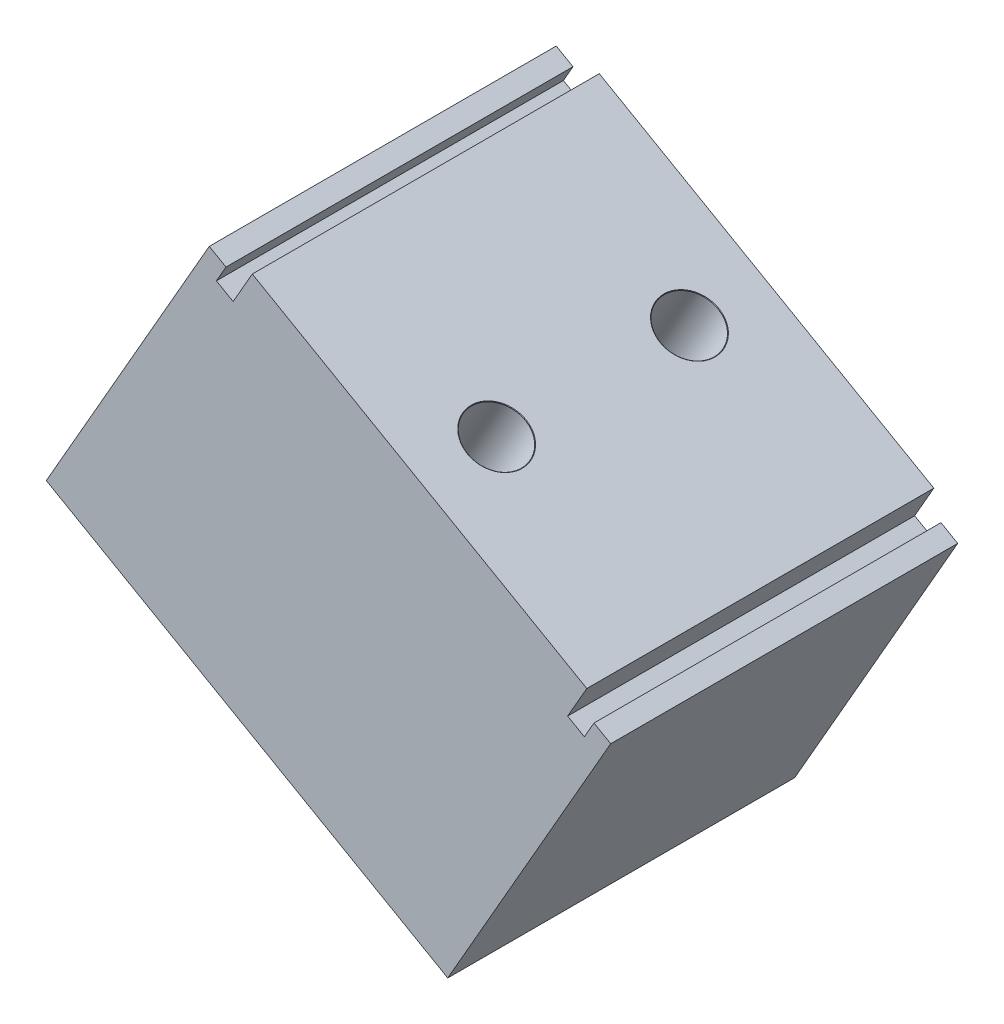
ISO-10303-21;
HEADER;
FILE_DESCRIPTION(('STEP AP214'),'2;1');
FILE_NAME('part.step','',(''),(''),'','','');
FILE_SCHEMA(('AUTOMOTIVE_DESIGN { 1 0 10303 214 1 1 1 1 }'));
ENDSEC;
DATA;
#1=APPLICATION_CONTEXT('core data for automotive mechanical design processes');
#2=APPLICATION_PROTOCOL_DEFINITION('international standard','automotive_design',2000,#1);
#3=PRODUCT_CONTEXT('',#1,'mechanical');
#4=PRODUCT('Part','Part','',(#3));
#5=PRODUCT_RELATED_PRODUCT_CATEGORY('part','',(#4));
#6=PRODUCT_DEFINITION_FORMATION('','',#4);
#7=PRODUCT_DEFINITION_CONTEXT('part definition',#1,'design');
#8=PRODUCT_DEFINITION('design','',#6,#7);
#9=PRODUCT_DEFINITION_SHAPE('','',#8);
#10=(LENGTH_UNIT() NAMED_UNIT(*) SI_UNIT(.MILLI.,.METRE.));
#11=(NAMED_UNIT(*) PLANE_ANGLE_UNIT() SI_UNIT($,.RADIAN.));
#12=(NAMED_UNIT(*) SI_UNIT($,.STERADIAN.) SOLID_ANGLE_UNIT());
#13=UNCERTAINTY_MEASURE_WITH_UNIT(LENGTH_MEASURE(1.E-05),#10,'distance_accuracy_value','');
#14=(GEOMETRIC_REPRESENTATION_CONTEXT(3) GLOBAL_UNCERTAINTY_ASSIGNED_CONTEXT((#13)) GLOBAL_UNIT_ASSIGNED_CONTEXT((#10,
#11,#12)) REPRESENTATION_CONTEXT('',''));
#15=CARTESIAN_POINT('',(0.,0.,0.));
#16=DIRECTION('',(0.,0.,1.));
#17=DIRECTION('',(1.,0.,0.));
#18=AXIS2_PLACEMENT_3D('',#15,#16,#17);
#19=CARTESIAN_POINT('',(50.8679611410851,-59.8679485135977,9.));
#20=DIRECTION('',(0.497216671518887,0.867626406677251,0.));
#21=DIRECTION('',(-0.867626406677252,0.497216671518887,0.));
#22=AXIS2_PLACEMENT_3D('',#19,#20,#21);
#23=PLANE('',#22);
#24=CARTESIAN_POINT('',(59.5442252078576,-64.8401152287865,5.));
#25=DIRECTION('',(-0.497216671518887,-0.867626406677251,0.));
#26=DIRECTION('',(-0.867626406677251,0.497216671518887,0.));
#27=AXIS2_PLACEMENT_3D('',#24,#25,#26);
#28=CIRCLE('',#27,1.525);
#29=CARTESIAN_POINT('',(58.2210949376748,-64.0818598047202,5.));
#30=VERTEX_POINT('',#29);
#31=EDGE_CURVE('E148',#30,#30,#28,.T.);
#32=ORIENTED_EDGE('',*,*,#31,.T.);
#33=EDGE_LOOP('',(#32));
#34=FACE_BOUND('',#33,.T.);
#35=CARTESIAN_POINT('',(59.5442252078576,-64.8401152287865,-5.));
#36=DIRECTION('',(-0.497216671518887,-0.867626406677251,0.));
#37=DIRECTION('',(-0.867626406677251,0.497216671518887,0.));
#38=AXIS2_PLACEMENT_3D('',#35,#36,#37);
#39=CIRCLE('',#38,1.525);
#40=CARTESIAN_POINT('',(58.2210949376748,-64.0818598047202,-5.));
#41=VERTEX_POINT('',#40);
#42=EDGE_CURVE('E141',#41,#41,#39,.T.);
#43=ORIENTED_EDGE('',*,*,#42,.T.);
#44=EDGE_LOOP('',(#43));
#45=FACE_BOUND('',#44,.T.);
#46=DIRECTION('',(0.,0.,-1.));
#47=VECTOR('',#46,1.);
#48=CARTESIAN_POINT('',(50.8679611410851,-59.8679485135977,9.));
#49=LINE('',#48,#47);
#50=CARTESIAN_POINT('',(50.8679611410851,-59.8679485135977,9.));
#51=VERTEX_POINT('',#50);
#52=CARTESIAN_POINT('',(50.8679611410851,-59.8679485135977,-9.));
#53=VERTEX_POINT('',#52);
#54=EDGE_CURVE('E40',#51,#53,#49,.T.);
#55=ORIENTED_EDGE('',*,*,#54,.F.);
#56=DIRECTION('',(-0.867626406677251,0.497216671518887,0.));
#57=VECTOR('',#56,1.);
#58=CARTESIAN_POINT('',(50.8679611410851,-59.8679485135977,9.));
#59=LINE('',#58,#57);
#60=CARTESIAN_POINT('',(68.2204892746301,-69.8122819439754,9.));
#61=VERTEX_POINT('',#60);
#62=EDGE_CURVE('E182',#61,#51,#59,.T.);
#63=ORIENTED_EDGE('',*,*,#62,.F.);
#64=DIRECTION('',(0.,0.,-1.));
#65=VECTOR('',#64,1.);
#66=CARTESIAN_POINT('',(68.2204892746301,-69.8122819439754,9.));
#67=LINE('',#66,#65);
#68=CARTESIAN_POINT('',(68.2204892746301,-69.8122819439754,-9.));
#69=VERTEX_POINT('',#68);
#70=EDGE_CURVE('E11',#61,#69,#67,.T.);
#71=ORIENTED_EDGE('',*,*,#70,.T.);
#72=DIRECTION('',(-0.867626406677251,0.497216671518887,0.));
#73=VECTOR('',#72,1.);
#74=CARTESIAN_POINT('',(50.8679611410851,-59.8679485135977,-9.));
#75=LINE('',#74,#73);
#76=EDGE_CURVE('E157',#69,#53,#75,.T.);
#77=ORIENTED_EDGE('',*,*,#76,.T.);
#78=EDGE_LOOP('',(#55,#63,#71,#77));
#79=FACE_BOUND('',#78,.T.);
#80=ADVANCED_FACE('F37',(#34,#45,#79),#23,.T.);
#81=CARTESIAN_POINT('',(68.2204892746301,-69.8122819439754,9.));
#82=DIRECTION('',(0.867626406677254,-0.497216671518883,0.));
#83=DIRECTION('',(0.497216671518883,0.867626406677254,0.));
#84=AXIS2_PLACEMENT_3D('',#81,#82,#83);
#85=PLANE('',#84);
#86=ORIENTED_EDGE('',*,*,#70,.F.);
#87=DIRECTION('',(0.497216671518883,0.867626406677254,0.));
#88=VECTOR('',#87,1.);
#89=CARTESIAN_POINT('',(68.2204892746301,-69.8122819439754,9.));
#90=LINE('',#89,#88);
#91=CARTESIAN_POINT('',(67.2260559315923,-71.5475347573299,9.));
#92=VERTEX_POINT('',#91);
#93=EDGE_CURVE('E53',#92,#61,#90,.T.);
#94=ORIENTED_EDGE('',*,*,#93,.F.);
#95=DIRECTION('',(0.,0.,-1.));
#96=VECTOR('',#95,1.);
#97=CARTESIAN_POINT('',(67.2260559315923,-71.5475347573299,9.));
#98=LINE('',#97,#96);
#99=CARTESIAN_POINT('',(67.2260559315923,-71.5475347573299,-9.));
#100=VERTEX_POINT('',#99);
#101=EDGE_CURVE('E45',#92,#100,#98,.T.);
#102=ORIENTED_EDGE('',*,*,#101,.T.);
#103=DIRECTION('',(0.497216671518883,0.867626406677254,0.));
#104=VECTOR('',#103,1.);
#105=CARTESIAN_POINT('',(68.2204892746301,-69.8122819439754,-9.));
#106=LINE('',#105,#104);
#107=EDGE_CURVE('E180',#100,#69,#106,.T.);
#108=ORIENTED_EDGE('',*,*,#107,.T.);
#109=EDGE_LOOP('',(#86,#94,#102,#108));
#110=FACE_BOUND('',#109,.T.);
#111=ADVANCED_FACE('F287',(#110),#85,.T.);
#112=CARTESIAN_POINT('',(67.2260559315923,-71.5475347573299,9.));
#113=DIRECTION('',(0.497216671518904,0.867626406677242,0.));
#114=DIRECTION('',(-0.867626406677242,0.497216671518904,0.));
#115=AXIS2_PLACEMENT_3D('',#112,#113,#114);
#116=PLANE('',#115);
#117=ORIENTED_EDGE('',*,*,#101,.F.);
#118=DIRECTION('',(-0.867626406677242,0.497216671518904,0.));
#119=VECTOR('',#118,1.);
#120=CARTESIAN_POINT('',(67.2260559315923,-71.5475347573299,9.));
#121=LINE('',#120,#119);
#122=CARTESIAN_POINT('',(68.0936823382696,-72.0447514288488,9.));
#123=VERTEX_POINT('',#122);
#124=EDGE_CURVE('E58',#123,#92,#121,.T.);
#125=ORIENTED_EDGE('',*,*,#124,.F.);
#126=DIRECTION('',(0.,0.,-1.));
#127=VECTOR('',#126,1.);
#128=CARTESIAN_POINT('',(68.0936823382696,-72.0447514288488,9.));
#129=LINE('',#128,#127);
#130=CARTESIAN_POINT('',(68.0936823382696,-72.0447514288488,-9.));
#131=VERTEX_POINT('',#130);
#132=EDGE_CURVE('E206',#123,#131,#129,.T.);
#133=ORIENTED_EDGE('',*,*,#132,.T.);
#134=DIRECTION('',(-0.867626406677242,0.497216671518904,0.));
#135=VECTOR('',#134,1.);
#136=CARTESIAN_POINT('',(67.2260559315923,-71.5475347573299,-9.));
#137=LINE('',#136,#135);
#138=EDGE_CURVE('E178',#131,#100,#137,.T.);
#139=ORIENTED_EDGE('',*,*,#138,.T.);
#140=EDGE_LOOP('',(#117,#125,#133,#139));
#141=FACE_BOUND('',#140,.T.);
#142=ADVANCED_FACE('F285',(#141),#116,.T.);
#143=CARTESIAN_POINT('',(68.0936823382696,-72.0447514288488,9.));
#144=DIRECTION('',(-0.867626406677257,0.497216671518877,0.));
#145=DIRECTION('',(-0.497216671518877,-0.867626406677257,0.));
#146=AXIS2_PLACEMENT_3D('',#143,#144,#145);
#147=PLANE('',#146);
#148=ORIENTED_EDGE('',*,*,#132,.F.);
#149=DIRECTION('',(-0.497216671518877,-0.867626406677257,0.));
#150=VECTOR('',#149,1.);
#151=CARTESIAN_POINT('',(68.0936823382696,-72.0447514288488,9.));
#152=LINE('',#151,#150);
#153=CARTESIAN_POINT('',(68.5908990097884,-71.1771250221715,9.));
#154=VERTEX_POINT('',#153);
#155=EDGE_CURVE('E200',#154,#123,#152,.T.);
#156=ORIENTED_EDGE('',*,*,#155,.F.);
#157=DIRECTION('',(0.,0.,-1.));
#158=VECTOR('',#157,1.);
#159=CARTESIAN_POINT('',(68.5908990097884,-71.1771250221715,9.));
#160=LINE('',#159,#158);
#161=CARTESIAN_POINT('',(68.5908990097884,-71.1771250221715,-9.));
#162=VERTEX_POINT('',#161);
#163=EDGE_CURVE('E209',#154,#162,#160,.T.);
#164=ORIENTED_EDGE('',*,*,#163,.T.);
#165=DIRECTION('',(-0.497216671518877,-0.867626406677257,0.));
#166=VECTOR('',#165,1.);
#167=CARTESIAN_POINT('',(68.0936823382696,-72.0447514288488,-9.));
#168=LINE('',#167,#166);
#169=EDGE_CURVE('E176',#162,#131,#168,.T.);
#170=ORIENTED_EDGE('',*,*,#169,.T.);
#171=EDGE_LOOP('',(#148,#156,#164,#170));
#172=FACE_BOUND('',#171,.T.);
#173=ADVANCED_FACE('F283',(#172),#147,.T.);
#174=CARTESIAN_POINT('',(68.5908990097884,-71.1771250221715,9.));
#175=DIRECTION('',(0.497216671518887,0.867626406677251,0.));
#176=DIRECTION('',(-0.867626406677251,0.497216671518887,0.));
#177=AXIS2_PLACEMENT_3D('',#174,#175,#176);
#178=PLANE('',#177);
#179=ORIENTED_EDGE('',*,*,#163,.F.);
#180=DIRECTION('',(-0.867626406677251,0.497216671518887,0.));
#181=VECTOR('',#180,1.);
#182=CARTESIAN_POINT('',(68.5908990097884,-71.1771250221715,9.));
#183=LINE('',#182,#181);
#184=CARTESIAN_POINT('',(69.4585254164657,-71.6743416936904,9.));
#185=VERTEX_POINT('',#184);
#186=EDGE_CURVE('E198',#185,#154,#183,.T.);
#187=ORIENTED_EDGE('',*,*,#186,.F.);
#188=DIRECTION('',(0.,0.,-1.));
#189=VECTOR('',#188,1.);
#190=CARTESIAN_POINT('',(69.4585254164657,-71.6743416936904,9.));
#191=LINE('',#190,#189);
#192=CARTESIAN_POINT('',(69.4585254164657,-71.6743416936904,-9.));
#193=VERTEX_POINT('',#192);
#194=EDGE_CURVE('E212',#185,#193,#191,.T.);
#195=ORIENTED_EDGE('',*,*,#194,.T.);
#196=DIRECTION('',(-0.867626406677251,0.497216671518887,0.));
#197=VECTOR('',#196,1.);
#198=CARTESIAN_POINT('',(68.5908990097884,-71.1771250221715,-9.));
#199=LINE('',#198,#197);
#200=EDGE_CURVE('E174',#193,#162,#199,.T.);
#201=ORIENTED_EDGE('',*,*,#200,.T.);
#202=EDGE_LOOP('',(#179,#187,#195,#201));
#203=FACE_BOUND('',#202,.T.);
#204=ADVANCED_FACE('F278',(#203),#178,.T.);
#205=CARTESIAN_POINT('',(69.4585254164657,-71.6743416936904,9.));
#206=DIRECTION('',(0.867626406677251,-0.497216671518888,0.));
#207=DIRECTION('',(0.497216671518888,0.867626406677251,0.));
#208=AXIS2_PLACEMENT_3D('',#205,#206,#207);
#209=PLANE('',#208);
#210=ORIENTED_EDGE('',*,*,#194,.F.);
#211=DIRECTION('',(0.497216671518888,0.867626406677251,0.));
#212=VECTOR('',#211,1.);
#213=CARTESIAN_POINT('',(69.4585254164657,-71.6743416936904,9.));
#214=LINE('',#213,#212);
#215=CARTESIAN_POINT('',(61.0058420006446,-86.4239906072037,9.));
#216=VERTEX_POINT('',#215);
#217=EDGE_CURVE('E196',#216,#185,#214,.T.);
#218=ORIENTED_EDGE('',*,*,#217,.F.);
#219=DIRECTION('',(0.,0.,-1.));
#220=VECTOR('',#219,1.);
#221=CARTESIAN_POINT('',(61.0058420006446,-86.4239906072037,9.));
#222=LINE('',#221,#220);
#223=CARTESIAN_POINT('',(61.0058420006446,-86.4239906072037,-9.));
#224=VERTEX_POINT('',#223);
#225=EDGE_CURVE('E215',#216,#224,#222,.T.);
#226=ORIENTED_EDGE('',*,*,#225,.T.);
#227=DIRECTION('',(0.497216671518888,0.867626406677251,0.));
#228=VECTOR('',#227,1.);
#229=CARTESIAN_POINT('',(69.4585254164657,-71.6743416936904,-9.));
#230=LINE('',#229,#228);
#231=EDGE_CURVE('E172',#224,#193,#230,.T.);
#232=ORIENTED_EDGE('',*,*,#231,.T.);
#233=EDGE_LOOP('',(#210,#218,#226,#232));
#234=FACE_BOUND('',#233,.T.);
#235=ADVANCED_FACE('F274',(#234),#209,.T.);
#236=CARTESIAN_POINT('',(40.1828082403906,-74.4907904907504,9.));
#237=DIRECTION('',(-0.497216671518887,-0.867626406677251,0.));
#238=DIRECTION('',(0.867626406677251,-0.497216671518887,0.));
#239=AXIS2_PLACEMENT_3D('',#236,#237,#238);
#240=PLANE('',#239);
#241=ORIENTED_EDGE('',*,*,#225,.F.);
#242=DIRECTION('',(0.867626406677251,-0.497216671518887,0.));
#243=VECTOR('',#242,1.);
#244=CARTESIAN_POINT('',(40.1828082403906,-74.4907904907504,9.));
#245=LINE('',#244,#243);
#246=CARTESIAN_POINT('',(40.1828082403906,-74.4907904907504,9.));
#247=VERTEX_POINT('',#246);
#248=EDGE_CURVE('E194',#247,#216,#245,.T.);
#249=ORIENTED_EDGE('',*,*,#248,.F.);
#250=DIRECTION('',(0.,0.,-1.));
#251=VECTOR('',#250,1.);
#252=CARTESIAN_POINT('',(40.1828082403906,-74.4907904907504,9.));
#253=LINE('',#252,#251);
#254=CARTESIAN_POINT('',(40.1828082403906,-74.4907904907504,-9.));
#255=VERTEX_POINT('',#254);
#256=EDGE_CURVE('E218',#247,#255,#253,.T.);
#257=ORIENTED_EDGE('',*,*,#256,.T.);
#258=DIRECTION('',(0.867626406677251,-0.497216671518887,0.));
#259=VECTOR('',#258,1.);
#260=CARTESIAN_POINT('',(40.1828082403906,-74.4907904907504,-9.));
#261=LINE('',#260,#259);
#262=EDGE_CURVE('E170',#255,#224,#261,.T.);
#263=ORIENTED_EDGE('',*,*,#262,.T.);
#264=EDGE_LOOP('',(#241,#249,#257,#263));
#265=FACE_BOUND('',#264,.T.);
#266=ADVANCED_FACE('F268',(#265),#240,.T.);
#267=CARTESIAN_POINT('',(48.6354916562117,-59.7411415772371,9.));
#268=DIRECTION('',(-0.867626406677252,0.497216671518886,0.));
#269=DIRECTION('',(-0.497216671518886,-0.867626406677252,0.));
#270=AXIS2_PLACEMENT_3D('',#267,#268,#269);
#271=PLANE('',#270);
#272=ORIENTED_EDGE('',*,*,#256,.F.);
#273=DIRECTION('',(-0.497216671518886,-0.867626406677252,0.));
#274=VECTOR('',#273,1.);
#275=CARTESIAN_POINT('',(48.6354916562117,-59.7411415772371,9.));
#276=LINE('',#275,#274);
#277=CARTESIAN_POINT('',(48.6354916562117,-59.7411415772371,9.));
#278=VERTEX_POINT('',#277);
#279=EDGE_CURVE('E192',#278,#247,#276,.T.);
#280=ORIENTED_EDGE('',*,*,#279,.F.);
#281=DIRECTION('',(0.,0.,-1.));
#282=VECTOR('',#281,1.);
#283=CARTESIAN_POINT('',(48.6354916562117,-59.7411415772371,9.));
#284=LINE('',#283,#282);
#285=CARTESIAN_POINT('',(48.6354916562117,-59.7411415772371,-9.));
#286=VERTEX_POINT('',#285);
#287=EDGE_CURVE('E221',#278,#286,#284,.T.);
#288=ORIENTED_EDGE('',*,*,#287,.T.);
#289=DIRECTION('',(-0.497216671518886,-0.867626406677252,0.));
#290=VECTOR('',#289,1.);
#291=CARTESIAN_POINT('',(48.6354916562117,-59.7411415772371,-9.));
#292=LINE('',#291,#290);
#293=EDGE_CURVE('E168',#286,#255,#292,.T.);
#294=ORIENTED_EDGE('',*,*,#293,.T.);
#295=EDGE_LOOP('',(#272,#280,#288,#294));
#296=FACE_BOUND('',#295,.T.);
#297=ADVANCED_FACE('F263',(#296),#271,.T.);
#298=CARTESIAN_POINT('',(49.5031180628889,-60.238358248756,9.));
#299=DIRECTION('',(0.497216671518887,0.867626406677251,0.));
#300=DIRECTION('',(-0.867626406677251,0.497216671518887,0.));
#301=AXIS2_PLACEMENT_3D('',#298,#299,#300);
#302=PLANE('',#301);
#303=ORIENTED_EDGE('',*,*,#287,.F.);
#304=DIRECTION('',(-0.867626406677251,0.497216671518887,0.));
#305=VECTOR('',#304,1.);
#306=CARTESIAN_POINT('',(49.5031180628889,-60.238358248756,9.));
#307=LINE('',#306,#305);
#308=CARTESIAN_POINT('',(49.5031180628889,-60.238358248756,9.));
#309=VERTEX_POINT('',#308);
#310=EDGE_CURVE('E190',#309,#278,#307,.T.);
#311=ORIENTED_EDGE('',*,*,#310,.F.);
#312=DIRECTION('',(0.,0.,-1.));
#313=VECTOR('',#312,1.);
#314=CARTESIAN_POINT('',(49.5031180628889,-60.238358248756,9.));
#315=LINE('',#314,#313);
#316=CARTESIAN_POINT('',(49.5031180628889,-60.238358248756,-9.));
#317=VERTEX_POINT('',#316);
#318=EDGE_CURVE('E224',#309,#317,#315,.T.);
#319=ORIENTED_EDGE('',*,*,#318,.T.);
#320=DIRECTION('',(-0.867626406677251,0.497216671518887,0.));
#321=VECTOR('',#320,1.);
#322=CARTESIAN_POINT('',(49.5031180628889,-60.238358248756,-9.));
#323=LINE('',#322,#321);
#324=EDGE_CURVE('E166',#317,#286,#323,.T.);
#325=ORIENTED_EDGE('',*,*,#324,.T.);
#326=EDGE_LOOP('',(#303,#311,#319,#325));
#327=FACE_BOUND('',#326,.T.);
#328=ADVANCED_FACE('F260',(#327),#302,.T.);
#329=CARTESIAN_POINT('',(49.00590139137,-61.1059846554333,9.));
#330=DIRECTION('',(0.867626406677248,-0.497216671518893,0.));
#331=DIRECTION('',(0.497216671518893,0.867626406677248,0.));
#332=AXIS2_PLACEMENT_3D('',#329,#330,#331);
#333=PLANE('',#332);
#334=ORIENTED_EDGE('',*,*,#318,.F.);
#335=DIRECTION('',(0.497216671518893,0.867626406677248,0.));
#336=VECTOR('',#335,1.);
#337=CARTESIAN_POINT('',(49.00590139137,-61.1059846554333,9.));
#338=LINE('',#337,#336);
#339=CARTESIAN_POINT('',(49.00590139137,-61.1059846554333,9.));
#340=VERTEX_POINT('',#339);
#341=EDGE_CURVE('E188',#340,#309,#338,.T.);
#342=ORIENTED_EDGE('',*,*,#341,.F.);
#343=DIRECTION('',(0.,0.,-1.));
#344=VECTOR('',#343,1.);
#345=CARTESIAN_POINT('',(49.00590139137,-61.1059846554333,9.));
#346=LINE('',#345,#344);
#347=CARTESIAN_POINT('',(49.00590139137,-61.1059846554333,-9.));
#348=VERTEX_POINT('',#347);
#349=EDGE_CURVE('E227',#340,#348,#346,.T.);
#350=ORIENTED_EDGE('',*,*,#349,.T.);
#351=DIRECTION('',(0.497216671518893,0.867626406677248,0.));
#352=VECTOR('',#351,1.);
#353=CARTESIAN_POINT('',(49.00590139137,-61.1059846554333,-9.));
#354=LINE('',#353,#352);
#355=EDGE_CURVE('E164',#348,#317,#354,.T.);
#356=ORIENTED_EDGE('',*,*,#355,.T.);
#357=EDGE_LOOP('',(#334,#342,#350,#356));
#358=FACE_BOUND('',#357,.T.);
#359=ADVANCED_FACE('F253',(#358),#333,.T.);
#360=CARTESIAN_POINT('',(49.8735277980473,-61.6032013269521,9.));
#361=DIRECTION('',(0.497216671518885,0.867626406677252,0.));
#362=DIRECTION('',(-0.867626406677253,0.497216671518885,0.));
#363=AXIS2_PLACEMENT_3D('',#360,#361,#362);
#364=PLANE('',#363);
#365=ORIENTED_EDGE('',*,*,#349,.F.);
#366=DIRECTION('',(-0.867626406677253,0.497216671518885,0.));
#367=VECTOR('',#366,1.);
#368=CARTESIAN_POINT('',(49.8735277980473,-61.6032013269521,9.));
#369=LINE('',#368,#367);
#370=CARTESIAN_POINT('',(49.8735277980473,-61.6032013269521,9.));
#371=VERTEX_POINT('',#370);
#372=EDGE_CURVE('E186',#371,#340,#369,.T.);
#373=ORIENTED_EDGE('',*,*,#372,.F.);
#374=DIRECTION('',(0.,0.,-1.));
#375=VECTOR('',#374,1.);
#376=CARTESIAN_POINT('',(49.8735277980473,-61.6032013269521,9.));
#377=LINE('',#376,#375);
#378=CARTESIAN_POINT('',(49.8735277980473,-61.6032013269521,-9.));
#379=VERTEX_POINT('',#378);
#380=EDGE_CURVE('E229',#371,#379,#377,.T.);
#381=ORIENTED_EDGE('',*,*,#380,.T.);
#382=DIRECTION('',(-0.867626406677253,0.497216671518885,0.));
#383=VECTOR('',#382,1.);
#384=CARTESIAN_POINT('',(49.8735277980473,-61.6032013269521,-9.));
#385=LINE('',#384,#383);
#386=EDGE_CURVE('E162',#379,#348,#385,.T.);
#387=ORIENTED_EDGE('',*,*,#386,.T.);
#388=EDGE_LOOP('',(#365,#373,#381,#387));
#389=FACE_BOUND('',#388,.T.);
#390=ADVANCED_FACE('F249',(#389),#364,.T.);
#391=CARTESIAN_POINT('',(50.8679611410851,-59.8679485135977,9.));
#392=DIRECTION('',(-0.867626406677248,0.497216671518893,0.));
#393=DIRECTION('',(-0.497216671518893,-0.867626406677248,0.));
#394=AXIS2_PLACEMENT_3D('',#391,#392,#393);
#395=PLANE('',#394);
#396=ORIENTED_EDGE('',*,*,#380,.F.);
#397=DIRECTION('',(-0.497216671518893,-0.867626406677248,0.));
#398=VECTOR('',#397,1.);
#399=CARTESIAN_POINT('',(50.8679611410851,-59.8679485135977,9.));
#400=LINE('',#399,#398);
#401=EDGE_CURVE('E184',#51,#371,#400,.T.);
#402=ORIENTED_EDGE('',*,*,#401,.F.);
#403=ORIENTED_EDGE('',*,*,#54,.T.);
#404=DIRECTION('',(-0.497216671518893,-0.867626406677248,0.));
#405=VECTOR('',#404,1.);
#406=CARTESIAN_POINT('',(50.8679611410851,-59.8679485135977,-9.));
#407=LINE('',#406,#405);
#408=EDGE_CURVE('E160',#53,#379,#407,.T.);
#409=ORIENTED_EDGE('',*,*,#408,.T.);
#410=EDGE_LOOP('',(#396,#402,#403,#409));
#411=FACE_BOUND('',#410,.T.);
#412=ADVANCED_FACE('F237',(#411),#395,.T.);
#413=CARTESIAN_POINT('',(0.,0.,9.));
#414=DIRECTION('',(0.,0.,1.));
#415=DIRECTION('',(-1.,0.,0.));
#416=AXIS2_PLACEMENT_3D('',#413,#414,#415);
#417=PLANE('',#416);
#418=ORIENTED_EDGE('',*,*,#62,.T.);
#419=ORIENTED_EDGE('',*,*,#401,.T.);
#420=ORIENTED_EDGE('',*,*,#372,.T.);
#421=ORIENTED_EDGE('',*,*,#341,.T.);
#422=ORIENTED_EDGE('',*,*,#310,.T.);
#423=ORIENTED_EDGE('',*,*,#279,.T.);
#424=ORIENTED_EDGE('',*,*,#248,.T.);
#425=ORIENTED_EDGE('',*,*,#217,.T.);
#426=ORIENTED_EDGE('',*,*,#186,.T.);
#427=ORIENTED_EDGE('',*,*,#155,.T.);
#428=ORIENTED_EDGE('',*,*,#124,.T.);
#429=ORIENTED_EDGE('',*,*,#93,.T.);
#430=EDGE_LOOP('',(#418,#419,#420,#421,#422,#423,#424,#425,#426,#427,#428,#429));
#431=FACE_BOUND('',#430,.T.);
#432=ADVANCED_FACE('F255',(#431),#417,.T.);
#433=CARTESIAN_POINT('',(0.,0.,-9.));
#434=DIRECTION('',(0.,0.,1.));
#435=DIRECTION('',(-1.,0.,0.));
#436=AXIS2_PLACEMENT_3D('',#433,#434,#435);
#437=PLANE('',#436);
#438=ORIENTED_EDGE('',*,*,#76,.F.);
#439=ORIENTED_EDGE('',*,*,#107,.F.);
#440=ORIENTED_EDGE('',*,*,#138,.F.);
#441=ORIENTED_EDGE('',*,*,#169,.F.);
#442=ORIENTED_EDGE('',*,*,#200,.F.);
#443=ORIENTED_EDGE('',*,*,#231,.F.);
#444=ORIENTED_EDGE('',*,*,#262,.F.);
#445=ORIENTED_EDGE('',*,*,#293,.F.);
#446=ORIENTED_EDGE('',*,*,#324,.F.);
#447=ORIENTED_EDGE('',*,*,#355,.F.);
#448=ORIENTED_EDGE('',*,*,#386,.F.);
#449=ORIENTED_EDGE('',*,*,#408,.F.);
#450=EDGE_LOOP('',(#438,#439,#440,#441,#442,#443,#444,#445,#446,#447,#448,#449));
#451=FACE_BOUND('',#450,.T.);
#452=ADVANCED_FACE('F244',(#451),#437,.F.);
#453=CARTESIAN_POINT('',(57.555358521782,-68.3106208554956,-5.));
#454=DIRECTION('',(0.497216671518887,0.867626406677251,0.));
#455=DIRECTION('',(-0.867626406677251,0.497216671518887,0.));
#456=AXIS2_PLACEMENT_3D('',#453,#454,#455);
#457=CONICAL_SURFACE('',#456,1.49999999999999,1.02974425867665);
#458=CARTESIAN_POINT('',(57.1072216462225,-69.0926046651967,-5.));
#459=VERTEX_POINT('',#458);
#460=VERTEX_LOOP('',#459);
#461=FACE_BOUND('',#460,.T.);
#462=CARTESIAN_POINT('',(57.555358521782,-68.3106208554956,-5.));
#463=DIRECTION('',(-0.497216671518887,-0.867626406677251,0.));
#464=DIRECTION('',(-0.867626406677251,0.497216671518887,0.));
#465=AXIS2_PLACEMENT_3D('',#462,#463,#464);
#466=CIRCLE('',#465,1.49999999999999);
#467=CARTESIAN_POINT('',(56.2539189117661,-67.5647958482172,-5.));
#468=VERTEX_POINT('',#467);
#469=EDGE_CURVE('E154',#468,#468,#466,.T.);
#470=ORIENTED_EDGE('',*,*,#469,.F.);
#471=EDGE_LOOP('',(#470));
#472=FACE_BOUND('',#471,.T.);
#473=ADVANCED_FACE('F321',(#461,#472),#457,.F.);
#474=CARTESIAN_POINT('',(59.5442252078576,-64.8401152287865,-5.));
#475=DIRECTION('',(0.497216671518887,0.867626406677251,0.));
#476=DIRECTION('',(-0.867626406677251,0.497216671518887,0.));
#477=AXIS2_PLACEMENT_3D('',#474,#475,#476);
#478=CYLINDRICAL_SURFACE('',#477,1.49999999999999);
#479=ORIENTED_EDGE('',*,*,#469,.T.);
#480=EDGE_LOOP('',(#479));
#481=FACE_BOUND('',#480,.T.);
#482=CARTESIAN_POINT('',(59.5317947910696,-64.8618058889535,-5.));
#483=DIRECTION('',(-0.497216671518887,-0.867626406677251,0.));
#484=DIRECTION('',(-0.867626406677251,0.497216671518887,0.));
#485=AXIS2_PLACEMENT_3D('',#482,#483,#484);
#486=CIRCLE('',#485,1.5);
#487=CARTESIAN_POINT('',(58.2303551810537,-64.1159808816751,-5.));
#488=VERTEX_POINT('',#487);
#489=EDGE_CURVE('E145',#488,#488,#486,.T.);
#490=ORIENTED_EDGE('',*,*,#489,.F.);
#491=EDGE_LOOP('',(#490));
#492=FACE_BOUND('',#491,.T.);
#493=ADVANCED_FACE('F325',(#481,#492),#478,.F.);
#494=CARTESIAN_POINT('',(59.5442252078576,-64.8401152287865,-5.));
#495=DIRECTION('',(0.497216671518887,0.867626406677251,0.));
#496=DIRECTION('',(-0.867626406677251,0.497216671518887,0.));
#497=AXIS2_PLACEMENT_3D('',#494,#495,#496);
#498=CONICAL_SURFACE('',#497,1.525,0.785398163397548);
#499=ORIENTED_EDGE('',*,*,#489,.T.);
#500=EDGE_LOOP('',(#499));
#501=FACE_BOUND('',#500,.T.);
#502=ORIENTED_EDGE('',*,*,#42,.F.);
#503=EDGE_LOOP('',(#502));
#504=FACE_BOUND('',#503,.T.);
#505=ADVANCED_FACE('F135',(#501,#504),#498,.F.);
#506=CARTESIAN_POINT('',(57.555358521782,-68.3106208554956,5.));
#507=DIRECTION('',(0.497216671518887,0.867626406677251,0.));
#508=DIRECTION('',(-0.867626406677251,0.497216671518887,0.));
#509=AXIS2_PLACEMENT_3D('',#506,#507,#508);
#510=CONICAL_SURFACE('',#509,1.49999999999999,1.02974425867665);
#511=CARTESIAN_POINT('',(57.1072216462225,-69.0926046651967,5.));
#512=VERTEX_POINT('',#511);
#513=VERTEX_LOOP('',#512);
#514=FACE_BOUND('',#513,.T.);
#515=CARTESIAN_POINT('',(57.555358521782,-68.3106208554956,5.));
#516=DIRECTION('',(-0.497216671518887,-0.867626406677251,0.));
#517=DIRECTION('',(-0.867626406677251,0.497216671518887,0.));
#518=AXIS2_PLACEMENT_3D('',#515,#516,#517);
#519=CIRCLE('',#518,1.49999999999999);
#520=CARTESIAN_POINT('',(56.2539189117661,-67.5647958482172,5.));
#521=VERTEX_POINT('',#520);
#522=EDGE_CURVE('E139',#521,#521,#519,.T.);
#523=ORIENTED_EDGE('',*,*,#522,.F.);
#524=EDGE_LOOP('',(#523));
#525=FACE_BOUND('',#524,.T.);
#526=ADVANCED_FACE('F131',(#514,#525),#510,.F.);
#527=CARTESIAN_POINT('',(59.5442252078576,-64.8401152287865,5.));
#528=DIRECTION('',(0.497216671518887,0.867626406677251,0.));
#529=DIRECTION('',(-0.867626406677251,0.497216671518887,0.));
#530=AXIS2_PLACEMENT_3D('',#527,#528,#529);
#531=CYLINDRICAL_SURFACE('',#530,1.49999999999999);
#532=ORIENTED_EDGE('',*,*,#522,.T.);
#533=EDGE_LOOP('',(#532));
#534=FACE_BOUND('',#533,.T.);
#535=CARTESIAN_POINT('',(59.5317947910696,-64.8618058889535,5.));
#536=DIRECTION('',(-0.497216671518887,-0.867626406677251,0.));
#537=DIRECTION('',(-0.867626406677251,0.497216671518887,0.));
#538=AXIS2_PLACEMENT_3D('',#535,#536,#537);
#539=CIRCLE('',#538,1.5);
#540=CARTESIAN_POINT('',(58.2303551810537,-64.1159808816751,5.));
#541=VERTEX_POINT('',#540);
#542=EDGE_CURVE('E142',#541,#541,#539,.T.);
#543=ORIENTED_EDGE('',*,*,#542,.F.);
#544=EDGE_LOOP('',(#543));
#545=FACE_BOUND('',#544,.T.);
#546=ADVANCED_FACE('F134',(#534,#545),#531,.F.);
#547=CARTESIAN_POINT('',(59.5442252078576,-64.8401152287865,5.));
#548=DIRECTION('',(0.497216671518887,0.867626406677251,0.));
#549=DIRECTION('',(-0.867626406677251,0.497216671518887,0.));
#550=AXIS2_PLACEMENT_3D('',#547,#548,#549);
#551=CONICAL_SURFACE('',#550,1.525,0.785398163397548);
#552=ORIENTED_EDGE('',*,*,#542,.T.);
#553=EDGE_LOOP('',(#552));
#554=FACE_BOUND('',#553,.T.);
#555=ORIENTED_EDGE('',*,*,#31,.F.);
#556=EDGE_LOOP('',(#555));
#557=FACE_BOUND('',#556,.T.);
#558=ADVANCED_FACE('F337',(#554,#557),#551,.F.);
#559=CLOSED_SHELL('',(#80,#111,#142,#173,#204,#235,#266,#297,#328,#359,#390,#412,#432,#452,#473,
#493,#505,#526,#546,#558));
#560=MANIFOLD_SOLID_BREP('B2',#559);
#561=ADVANCED_BREP_SHAPE_REPRESENTATION('',(#18,#560),#14);
#562=SHAPE_DEFINITION_REPRESENTATION(#9,#561);
ENDSEC;
END-ISO-10303-21;
